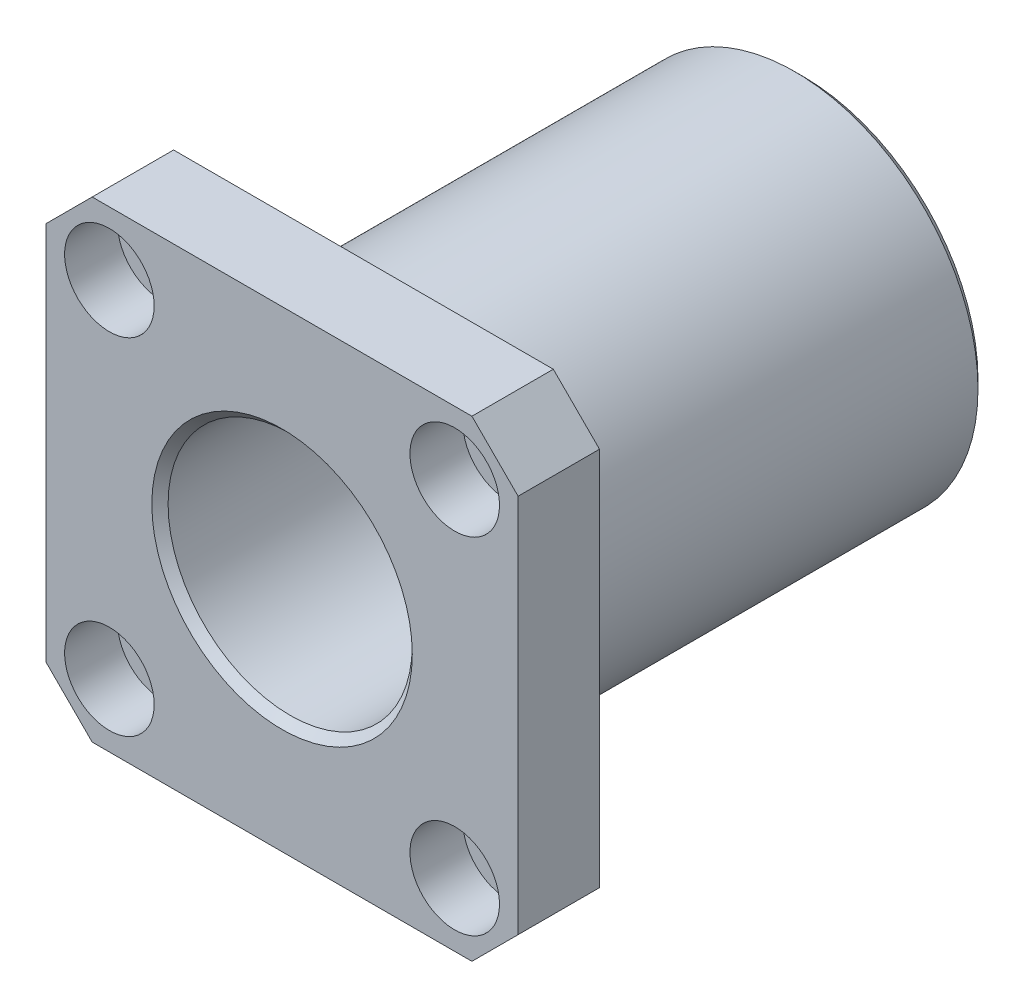
ISO-10303-21;
HEADER;
FILE_DESCRIPTION(('STEP AP214'),'2;1');
FILE_NAME('part.step','',(''),(''),'','','');
FILE_SCHEMA(('AUTOMOTIVE_DESIGN { 1 0 10303 214 1 1 1 1 }'));
ENDSEC;
DATA;
#1=APPLICATION_CONTEXT('core data for automotive mechanical design processes');
#2=APPLICATION_PROTOCOL_DEFINITION('international standard','automotive_design',2000,#1);
#3=PRODUCT_CONTEXT('',#1,'mechanical');
#4=PRODUCT('Part','Part','',(#3));
#5=PRODUCT_RELATED_PRODUCT_CATEGORY('part','',(#4));
#6=PRODUCT_DEFINITION_FORMATION('','',#4);
#7=PRODUCT_DEFINITION_CONTEXT('part definition',#1,'design');
#8=PRODUCT_DEFINITION('design','',#6,#7);
#9=PRODUCT_DEFINITION_SHAPE('','',#8);
#10=(LENGTH_UNIT() NAMED_UNIT(*) SI_UNIT(.MILLI.,.METRE.));
#11=(NAMED_UNIT(*) PLANE_ANGLE_UNIT() SI_UNIT($,.RADIAN.));
#12=(NAMED_UNIT(*) SI_UNIT($,.STERADIAN.) SOLID_ANGLE_UNIT());
#13=UNCERTAINTY_MEASURE_WITH_UNIT(LENGTH_MEASURE(1.E-05),#10,'distance_accuracy_value','');
#14=(GEOMETRIC_REPRESENTATION_CONTEXT(3) GLOBAL_UNCERTAINTY_ASSIGNED_CONTEXT((#13)) GLOBAL_UNIT_ASSIGNED_CONTEXT((#10,
#11,#12)) REPRESENTATION_CONTEXT('',''));
#15=CARTESIAN_POINT('',(0.,0.,0.));
#16=DIRECTION('',(0.,0.,1.));
#17=DIRECTION('',(1.,0.,0.));
#18=AXIS2_PLACEMENT_3D('',#15,#16,#17);
#19=CARTESIAN_POINT('',(0.,0.,64.));
#20=DIRECTION('',(0.,0.,-1.));
#21=DIRECTION('',(-1.,0.,0.));
#22=AXIS2_PLACEMENT_3D('',#19,#20,#21);
#23=CYLINDRICAL_SURFACE('',#22,22.5);
#24=CARTESIAN_POINT('',(0.,0.,1.));
#25=DIRECTION('',(0.,0.,1.));
#26=DIRECTION('',(1.,0.,0.));
#27=AXIS2_PLACEMENT_3D('',#24,#25,#26);
#28=CIRCLE('',#27,22.5);
#29=CARTESIAN_POINT('',(22.5,0.,1.));
#30=VERTEX_POINT('',#29);
#31=EDGE_CURVE('E141',#30,#30,#28,.T.);
#32=ORIENTED_EDGE('',*,*,#31,.T.);
#33=EDGE_LOOP('',(#32));
#34=FACE_BOUND('',#33,.T.);
#35=CARTESIAN_POINT('',(0.,0.,54.));
#36=DIRECTION('',(0.,0.,-1.));
#37=DIRECTION('',(-1.,0.,0.));
#38=AXIS2_PLACEMENT_3D('',#35,#36,#37);
#39=CIRCLE('',#38,22.5);
#40=CARTESIAN_POINT('',(-22.5,0.,54.));
#41=VERTEX_POINT('',#40);
#42=EDGE_CURVE('E138',#41,#41,#39,.T.);
#43=ORIENTED_EDGE('',*,*,#42,.T.);
#44=EDGE_LOOP('',(#43));
#45=FACE_BOUND('',#44,.T.);
#46=ADVANCED_FACE('F33',(#34,#45),#23,.T.);
#47=CARTESIAN_POINT('',(0.,0.,0.));
#48=DIRECTION('',(0.,0.,1.));
#49=DIRECTION('',(1.,0.,0.));
#50=AXIS2_PLACEMENT_3D('',#47,#48,#49);
#51=PLANE('',#50);
#52=CARTESIAN_POINT('',(0.,0.,0.));
#53=DIRECTION('',(0.,0.,1.));
#54=DIRECTION('',(1.,0.,0.));
#55=AXIS2_PLACEMENT_3D('',#52,#53,#54);
#56=CIRCLE('',#55,21.5);
#57=CARTESIAN_POINT('',(21.5,0.,0.));
#58=VERTEX_POINT('',#57);
#59=EDGE_CURVE('E164',#58,#58,#56,.F.);
#60=ORIENTED_EDGE('',*,*,#59,.T.);
#61=EDGE_LOOP('',(#60));
#62=FACE_BOUND('',#61,.T.);
#63=CARTESIAN_POINT('',(0.,0.,0.));
#64=DIRECTION('',(0.,0.,1.));
#65=DIRECTION('',(1.,0.,0.));
#66=AXIS2_PLACEMENT_3D('',#63,#64,#65);
#67=CIRCLE('',#66,15.);
#68=CARTESIAN_POINT('',(15.,0.,0.));
#69=VERTEX_POINT('',#68);
#70=EDGE_CURVE('E442',#69,#69,#67,.T.);
#71=ORIENTED_EDGE('',*,*,#70,.T.);
#72=EDGE_LOOP('',(#71));
#73=FACE_BOUND('',#72,.T.);
#74=ADVANCED_FACE('F181',(#62,#73),#51,.F.);
#75=CARTESIAN_POINT('',(29.,-29.,54.));
#76=DIRECTION('',(1.,0.,0.));
#77=DIRECTION('',(0.,0.,-1.));
#78=AXIS2_PLACEMENT_3D('',#75,#76,#77);
#79=PLANE('',#78);
#80=DIRECTION('',(0.,0.,1.));
#81=VECTOR('',#80,1.);
#82=CARTESIAN_POINT('',(29.,-23.3259018078045,0.));
#83=LINE('',#82,#81);
#84=CARTESIAN_POINT('',(29.,-23.3259018078045,54.));
#85=VERTEX_POINT('',#84);
#86=CARTESIAN_POINT('',(29.,-23.3259018078045,64.));
#87=VERTEX_POINT('',#86);
#88=EDGE_CURVE('E474',#85,#87,#83,.T.);
#89=ORIENTED_EDGE('',*,*,#88,.F.);
#90=DIRECTION('',(0.,1.,0.));
#91=VECTOR('',#90,1.);
#92=CARTESIAN_POINT('',(29.,-29.,54.));
#93=LINE('',#92,#91);
#94=CARTESIAN_POINT('',(29.,23.3259018078045,54.));
#95=VERTEX_POINT('',#94);
#96=EDGE_CURVE('E117',#85,#95,#93,.T.);
#97=ORIENTED_EDGE('',*,*,#96,.T.);
#98=DIRECTION('',(0.,0.,1.));
#99=VECTOR('',#98,1.);
#100=CARTESIAN_POINT('',(29.,23.3259018078045,0.));
#101=LINE('',#100,#99);
#102=CARTESIAN_POINT('',(29.,23.3259018078045,64.));
#103=VERTEX_POINT('',#102);
#104=EDGE_CURVE('E100',#95,#103,#101,.T.);
#105=ORIENTED_EDGE('',*,*,#104,.T.);
#106=DIRECTION('',(0.,1.,0.));
#107=VECTOR('',#106,1.);
#108=CARTESIAN_POINT('',(29.,-29.,64.));
#109=LINE('',#108,#107);
#110=EDGE_CURVE('E115',#87,#103,#109,.T.);
#111=ORIENTED_EDGE('',*,*,#110,.F.);
#112=EDGE_LOOP('',(#89,#97,#105,#111));
#113=FACE_BOUND('',#112,.T.);
#114=ADVANCED_FACE('F114',(#113),#79,.T.);
#115=CARTESIAN_POINT('',(-29.,-29.,54.));
#116=DIRECTION('',(0.,-1.,0.));
#117=DIRECTION('',(0.,0.,-1.));
#118=AXIS2_PLACEMENT_3D('',#115,#116,#117);
#119=PLANE('',#118);
#120=DIRECTION('',(0.,0.,1.));
#121=VECTOR('',#120,1.);
#122=CARTESIAN_POINT('',(-23.3259018078045,-29.,0.));
#123=LINE('',#122,#121);
#124=CARTESIAN_POINT('',(-23.3259018078045,-29.,54.));
#125=VERTEX_POINT('',#124);
#126=CARTESIAN_POINT('',(-23.3259018078045,-29.,64.));
#127=VERTEX_POINT('',#126);
#128=EDGE_CURVE('E48',#125,#127,#123,.T.);
#129=ORIENTED_EDGE('',*,*,#128,.F.);
#130=DIRECTION('',(1.,0.,0.));
#131=VECTOR('',#130,1.);
#132=CARTESIAN_POINT('',(-29.,-29.,54.));
#133=LINE('',#132,#131);
#134=CARTESIAN_POINT('',(23.3259018078045,-29.,54.));
#135=VERTEX_POINT('',#134);
#136=EDGE_CURVE('E131',#125,#135,#133,.T.);
#137=ORIENTED_EDGE('',*,*,#136,.T.);
#138=DIRECTION('',(0.,0.,1.));
#139=VECTOR('',#138,1.);
#140=CARTESIAN_POINT('',(23.3259018078045,-29.,0.));
#141=LINE('',#140,#139);
#142=CARTESIAN_POINT('',(23.3259018078045,-29.,64.));
#143=VERTEX_POINT('',#142);
#144=EDGE_CURVE('E108',#135,#143,#141,.T.);
#145=ORIENTED_EDGE('',*,*,#144,.T.);
#146=DIRECTION('',(1.,0.,0.));
#147=VECTOR('',#146,1.);
#148=CARTESIAN_POINT('',(-29.,-29.,64.));
#149=LINE('',#148,#147);
#150=EDGE_CURVE('E136',#127,#143,#149,.T.);
#151=ORIENTED_EDGE('',*,*,#150,.F.);
#152=EDGE_LOOP('',(#129,#137,#145,#151));
#153=FACE_BOUND('',#152,.T.);
#154=ADVANCED_FACE('F198',(#153),#119,.T.);
#155=CARTESIAN_POINT('',(-29.,-29.,54.));
#156=DIRECTION('',(-1.,0.,0.));
#157=DIRECTION('',(0.,0.,1.));
#158=AXIS2_PLACEMENT_3D('',#155,#156,#157);
#159=PLANE('',#158);
#160=DIRECTION('',(0.,0.,1.));
#161=VECTOR('',#160,1.);
#162=CARTESIAN_POINT('',(-29.,-23.3259018078045,0.));
#163=LINE('',#162,#161);
#164=CARTESIAN_POINT('',(-29.,-23.3259018078045,54.));
#165=VERTEX_POINT('',#164);
#166=CARTESIAN_POINT('',(-29.,-23.3259018078045,64.));
#167=VERTEX_POINT('',#166);
#168=EDGE_CURVE('E479',#165,#167,#163,.T.);
#169=ORIENTED_EDGE('',*,*,#168,.T.);
#170=DIRECTION('',(0.,-1.,0.));
#171=VECTOR('',#170,1.);
#172=CARTESIAN_POINT('',(-29.,-29.,64.));
#173=LINE('',#172,#171);
#174=CARTESIAN_POINT('',(-29.,23.3259018078045,64.));
#175=VERTEX_POINT('',#174);
#176=EDGE_CURVE('E126',#175,#167,#173,.T.);
#177=ORIENTED_EDGE('',*,*,#176,.F.);
#178=DIRECTION('',(0.,0.,1.));
#179=VECTOR('',#178,1.);
#180=CARTESIAN_POINT('',(-29.,23.3259018078045,0.));
#181=LINE('',#180,#179);
#182=CARTESIAN_POINT('',(-29.,23.3259018078045,54.));
#183=VERTEX_POINT('',#182);
#184=EDGE_CURVE('E56',#183,#175,#181,.T.);
#185=ORIENTED_EDGE('',*,*,#184,.F.);
#186=DIRECTION('',(0.,-1.,0.));
#187=VECTOR('',#186,1.);
#188=CARTESIAN_POINT('',(-29.,-29.,54.));
#189=LINE('',#188,#187);
#190=EDGE_CURVE('E496',#183,#165,#189,.T.);
#191=ORIENTED_EDGE('',*,*,#190,.T.);
#192=EDGE_LOOP('',(#169,#177,#185,#191));
#193=FACE_BOUND('',#192,.T.);
#194=ADVANCED_FACE('F202',(#193),#159,.T.);
#195=CARTESIAN_POINT('',(-29.,29.,54.));
#196=DIRECTION('',(0.,1.,0.));
#197=DIRECTION('',(0.,0.,1.));
#198=AXIS2_PLACEMENT_3D('',#195,#196,#197);
#199=PLANE('',#198);
#200=DIRECTION('',(0.,0.,1.));
#201=VECTOR('',#200,1.);
#202=CARTESIAN_POINT('',(23.3259018078045,29.,0.));
#203=LINE('',#202,#201);
#204=CARTESIAN_POINT('',(23.3259018078045,29.,54.));
#205=VERTEX_POINT('',#204);
#206=CARTESIAN_POINT('',(23.3259018078045,29.,64.));
#207=VERTEX_POINT('',#206);
#208=EDGE_CURVE('E103',#205,#207,#203,.T.);
#209=ORIENTED_EDGE('',*,*,#208,.F.);
#210=DIRECTION('',(-1.,0.,0.));
#211=VECTOR('',#210,1.);
#212=CARTESIAN_POINT('',(-29.,29.,54.));
#213=LINE('',#212,#211);
#214=CARTESIAN_POINT('',(-23.3259018078045,29.,54.));
#215=VERTEX_POINT('',#214);
#216=EDGE_CURVE('E494',#205,#215,#213,.T.);
#217=ORIENTED_EDGE('',*,*,#216,.T.);
#218=DIRECTION('',(0.,0.,1.));
#219=VECTOR('',#218,1.);
#220=CARTESIAN_POINT('',(-23.3259018078045,29.,0.));
#221=LINE('',#220,#219);
#222=CARTESIAN_POINT('',(-23.3259018078045,29.,64.));
#223=VERTEX_POINT('',#222);
#224=EDGE_CURVE('E484',#215,#223,#221,.T.);
#225=ORIENTED_EDGE('',*,*,#224,.T.);
#226=DIRECTION('',(-1.,0.,0.));
#227=VECTOR('',#226,1.);
#228=CARTESIAN_POINT('',(-29.,29.,64.));
#229=LINE('',#228,#227);
#230=EDGE_CURVE('E123',#207,#223,#229,.T.);
#231=ORIENTED_EDGE('',*,*,#230,.F.);
#232=EDGE_LOOP('',(#209,#217,#225,#231));
#233=FACE_BOUND('',#232,.T.);
#234=ADVANCED_FACE('F199',(#233),#199,.T.);
#235=CARTESIAN_POINT('',(0.,0.,54.));
#236=DIRECTION('',(0.,0.,-1.));
#237=DIRECTION('',(-1.,0.,0.));
#238=AXIS2_PLACEMENT_3D('',#235,#236,#237);
#239=PLANE('',#238);
#240=CARTESIAN_POINT('',(-21.2132034355964,21.2132034355964,54.));
#241=DIRECTION('',(0.,0.,-1.));
#242=DIRECTION('',(-1.,0.,0.));
#243=AXIS2_PLACEMENT_3D('',#240,#241,#242);
#244=CIRCLE('',#243,3.3);
#245=CARTESIAN_POINT('',(-24.5132034355964,21.2132034355964,54.));
#246=VERTEX_POINT('',#245);
#247=EDGE_CURVE('E157',#246,#246,#244,.T.);
#248=ORIENTED_EDGE('',*,*,#247,.F.);
#249=EDGE_LOOP('',(#248));
#250=FACE_BOUND('',#249,.T.);
#251=CARTESIAN_POINT('',(21.2132034355964,21.2132034355964,54.));
#252=DIRECTION('',(0.,0.,-1.));
#253=DIRECTION('',(-1.,0.,0.));
#254=AXIS2_PLACEMENT_3D('',#251,#252,#253);
#255=CIRCLE('',#254,3.3);
#256=CARTESIAN_POINT('',(17.9132034355964,21.2132034355964,54.));
#257=VERTEX_POINT('',#256);
#258=EDGE_CURVE('E152',#257,#257,#255,.T.);
#259=ORIENTED_EDGE('',*,*,#258,.F.);
#260=EDGE_LOOP('',(#259));
#261=FACE_BOUND('',#260,.T.);
#262=CARTESIAN_POINT('',(21.2132034355964,-21.2132034355964,54.));
#263=DIRECTION('',(0.,0.,-1.));
#264=DIRECTION('',(-1.,0.,0.));
#265=AXIS2_PLACEMENT_3D('',#262,#263,#264);
#266=CIRCLE('',#265,3.3);
#267=CARTESIAN_POINT('',(17.9132034355964,-21.2132034355964,54.));
#268=VERTEX_POINT('',#267);
#269=EDGE_CURVE('E147',#268,#268,#266,.T.);
#270=ORIENTED_EDGE('',*,*,#269,.F.);
#271=EDGE_LOOP('',(#270));
#272=FACE_BOUND('',#271,.T.);
#273=CARTESIAN_POINT('',(-21.2132034355964,-21.2132034355964,54.));
#274=DIRECTION('',(0.,0.,-1.));
#275=DIRECTION('',(-1.,0.,0.));
#276=AXIS2_PLACEMENT_3D('',#273,#274,#275);
#277=CIRCLE('',#276,3.3);
#278=CARTESIAN_POINT('',(-24.5132034355964,-21.2132034355964,54.));
#279=VERTEX_POINT('',#278);
#280=EDGE_CURVE('E142',#279,#279,#277,.T.);
#281=ORIENTED_EDGE('',*,*,#280,.F.);
#282=EDGE_LOOP('',(#281));
#283=FACE_BOUND('',#282,.T.);
#284=DIRECTION('',(0.707106781186548,-0.707106781186547,0.));
#285=VECTOR('',#284,1.);
#286=CARTESIAN_POINT('',(-26.1629509039023,-26.1629509039023,54.));
#287=LINE('',#286,#285);
#288=EDGE_CURVE('E124',#165,#125,#287,.T.);
#289=ORIENTED_EDGE('',*,*,#288,.F.);
#290=ORIENTED_EDGE('',*,*,#190,.F.);
#291=DIRECTION('',(-0.707106781186548,-0.707106781186547,0.));
#292=VECTOR('',#291,1.);
#293=CARTESIAN_POINT('',(-26.1629509039023,26.1629509039023,54.));
#294=LINE('',#293,#292);
#295=EDGE_CURVE('E487',#215,#183,#294,.T.);
#296=ORIENTED_EDGE('',*,*,#295,.F.);
#297=ORIENTED_EDGE('',*,*,#216,.F.);
#298=DIRECTION('',(-0.707106781186548,0.707106781186547,0.));
#299=VECTOR('',#298,1.);
#300=CARTESIAN_POINT('',(26.1629509039023,26.1629509039023,54.));
#301=LINE('',#300,#299);
#302=EDGE_CURVE('E490',#95,#205,#301,.T.);
#303=ORIENTED_EDGE('',*,*,#302,.F.);
#304=ORIENTED_EDGE('',*,*,#96,.F.);
#305=DIRECTION('',(0.707106781186548,0.707106781186547,0.));
#306=VECTOR('',#305,1.);
#307=CARTESIAN_POINT('',(26.1629509039023,-26.1629509039023,54.));
#308=LINE('',#307,#306);
#309=EDGE_CURVE('E128',#135,#85,#308,.T.);
#310=ORIENTED_EDGE('',*,*,#309,.F.);
#311=ORIENTED_EDGE('',*,*,#136,.F.);
#312=EDGE_LOOP('',(#289,#290,#296,#297,#303,#304,#310,#311));
#313=FACE_BOUND('',#312,.T.);
#314=ORIENTED_EDGE('',*,*,#42,.F.);
#315=EDGE_LOOP('',(#314));
#316=FACE_BOUND('',#315,.T.);
#317=ADVANCED_FACE('F194',(#250,#261,#272,#283,#313,#316),#239,.T.);
#318=CARTESIAN_POINT('',(0.,0.,64.));
#319=DIRECTION('',(0.,0.,1.));
#320=DIRECTION('',(1.,0.,0.));
#321=AXIS2_PLACEMENT_3D('',#318,#319,#320);
#322=PLANE('',#321);
#323=CARTESIAN_POINT('',(0.,0.,64.));
#324=DIRECTION('',(0.,0.,1.));
#325=DIRECTION('',(1.,0.,0.));
#326=AXIS2_PLACEMENT_3D('',#323,#324,#325);
#327=CIRCLE('',#326,16.);
#328=CARTESIAN_POINT('',(16.,0.,64.));
#329=VERTEX_POINT('',#328);
#330=EDGE_CURVE('E11',#329,#329,#327,.F.);
#331=ORIENTED_EDGE('',*,*,#330,.T.);
#332=EDGE_LOOP('',(#331));
#333=FACE_BOUND('',#332,.T.);
#334=CARTESIAN_POINT('',(-21.2132034355964,21.2132034355964,64.));
#335=DIRECTION('',(0.,0.,1.));
#336=DIRECTION('',(1.,0.,0.));
#337=AXIS2_PLACEMENT_3D('',#334,#335,#336);
#338=CIRCLE('',#337,5.5);
#339=CARTESIAN_POINT('',(-15.7132034355964,21.2132034355964,64.));
#340=VERTEX_POINT('',#339);
#341=EDGE_CURVE('E440',#340,#340,#338,.T.);
#342=ORIENTED_EDGE('',*,*,#341,.F.);
#343=EDGE_LOOP('',(#342));
#344=FACE_BOUND('',#343,.T.);
#345=CARTESIAN_POINT('',(21.2132034355964,21.2132034355964,64.));
#346=DIRECTION('',(0.,0.,1.));
#347=DIRECTION('',(1.,0.,0.));
#348=AXIS2_PLACEMENT_3D('',#345,#346,#347);
#349=CIRCLE('',#348,5.5);
#350=CARTESIAN_POINT('',(26.7132034355964,21.2132034355964,64.));
#351=VERTEX_POINT('',#350);
#352=EDGE_CURVE('E160',#351,#351,#349,.T.);
#353=ORIENTED_EDGE('',*,*,#352,.F.);
#354=EDGE_LOOP('',(#353));
#355=FACE_BOUND('',#354,.T.);
#356=CARTESIAN_POINT('',(21.2132034355964,-21.2132034355964,64.));
#357=DIRECTION('',(0.,0.,1.));
#358=DIRECTION('',(1.,0.,0.));
#359=AXIS2_PLACEMENT_3D('',#356,#357,#358);
#360=CIRCLE('',#359,5.5);
#361=CARTESIAN_POINT('',(26.7132034355964,-21.2132034355964,64.));
#362=VERTEX_POINT('',#361);
#363=EDGE_CURVE('E155',#362,#362,#360,.T.);
#364=ORIENTED_EDGE('',*,*,#363,.F.);
#365=EDGE_LOOP('',(#364));
#366=FACE_BOUND('',#365,.T.);
#367=CARTESIAN_POINT('',(-21.2132034355964,-21.2132034355964,64.));
#368=DIRECTION('',(0.,0.,1.));
#369=DIRECTION('',(1.,0.,0.));
#370=AXIS2_PLACEMENT_3D('',#367,#368,#369);
#371=CIRCLE('',#370,5.5);
#372=CARTESIAN_POINT('',(-15.7132034355964,-21.2132034355964,64.));
#373=VERTEX_POINT('',#372);
#374=EDGE_CURVE('E150',#373,#373,#371,.T.);
#375=ORIENTED_EDGE('',*,*,#374,.F.);
#376=EDGE_LOOP('',(#375));
#377=FACE_BOUND('',#376,.T.);
#378=DIRECTION('',(-0.707106781186548,0.707106781186547,0.));
#379=VECTOR('',#378,1.);
#380=CARTESIAN_POINT('',(-29.,-23.3259018078045,64.));
#381=LINE('',#380,#379);
#382=EDGE_CURVE('E145',#127,#167,#381,.T.);
#383=ORIENTED_EDGE('',*,*,#382,.F.);
#384=ORIENTED_EDGE('',*,*,#150,.T.);
#385=DIRECTION('',(-0.707106781186548,-0.707106781186547,0.));
#386=VECTOR('',#385,1.);
#387=CARTESIAN_POINT('',(29.,-23.3259018078045,64.));
#388=LINE('',#387,#386);
#389=EDGE_CURVE('E122',#87,#143,#388,.T.);
#390=ORIENTED_EDGE('',*,*,#389,.F.);
#391=ORIENTED_EDGE('',*,*,#110,.T.);
#392=DIRECTION('',(0.707106781186548,-0.707106781186547,0.));
#393=VECTOR('',#392,1.);
#394=CARTESIAN_POINT('',(29.,23.3259018078045,64.));
#395=LINE('',#394,#393);
#396=EDGE_CURVE('E97',#207,#103,#395,.T.);
#397=ORIENTED_EDGE('',*,*,#396,.F.);
#398=ORIENTED_EDGE('',*,*,#230,.T.);
#399=DIRECTION('',(0.707106781186548,0.707106781186547,0.));
#400=VECTOR('',#399,1.);
#401=CARTESIAN_POINT('',(-29.,23.3259018078045,64.));
#402=LINE('',#401,#400);
#403=EDGE_CURVE('E471',#175,#223,#402,.T.);
#404=ORIENTED_EDGE('',*,*,#403,.F.);
#405=ORIENTED_EDGE('',*,*,#176,.T.);
#406=EDGE_LOOP('',(#383,#384,#390,#391,#397,#398,#404,#405));
#407=FACE_BOUND('',#406,.T.);
#408=ADVANCED_FACE('F120',(#333,#344,#355,#366,#377,#407),#322,.T.);
#409=CARTESIAN_POINT('',(-29.,23.3259018078045,0.));
#410=DIRECTION('',(0.707106781186547,-0.707106781186548,0.));
#411=DIRECTION('',(0.707106781186548,0.707106781186547,0.));
#412=AXIS2_PLACEMENT_3D('',#409,#410,#411);
#413=PLANE('',#412);
#414=ORIENTED_EDGE('',*,*,#295,.T.);
#415=ORIENTED_EDGE('',*,*,#184,.T.);
#416=ORIENTED_EDGE('',*,*,#403,.T.);
#417=ORIENTED_EDGE('',*,*,#224,.F.);
#418=EDGE_LOOP('',(#414,#415,#416,#417));
#419=FACE_BOUND('',#418,.T.);
#420=ADVANCED_FACE('F193',(#419),#413,.F.);
#421=CARTESIAN_POINT('',(29.,23.3259018078045,0.));
#422=DIRECTION('',(-0.707106781186547,-0.707106781186548,0.));
#423=DIRECTION('',(0.707106781186548,-0.707106781186547,0.));
#424=AXIS2_PLACEMENT_3D('',#421,#422,#423);
#425=PLANE('',#424);
#426=ORIENTED_EDGE('',*,*,#302,.T.);
#427=ORIENTED_EDGE('',*,*,#208,.T.);
#428=ORIENTED_EDGE('',*,*,#396,.T.);
#429=ORIENTED_EDGE('',*,*,#104,.F.);
#430=EDGE_LOOP('',(#426,#427,#428,#429));
#431=FACE_BOUND('',#430,.T.);
#432=ADVANCED_FACE('F99',(#431),#425,.F.);
#433=CARTESIAN_POINT('',(29.,-23.3259018078045,0.));
#434=DIRECTION('',(-0.707106781186547,0.707106781186548,0.));
#435=DIRECTION('',(-0.707106781186548,-0.707106781186547,0.));
#436=AXIS2_PLACEMENT_3D('',#433,#434,#435);
#437=PLANE('',#436);
#438=ORIENTED_EDGE('',*,*,#309,.T.);
#439=ORIENTED_EDGE('',*,*,#88,.T.);
#440=ORIENTED_EDGE('',*,*,#389,.T.);
#441=ORIENTED_EDGE('',*,*,#144,.F.);
#442=EDGE_LOOP('',(#438,#439,#440,#441));
#443=FACE_BOUND('',#442,.T.);
#444=ADVANCED_FACE('F219',(#443),#437,.F.);
#445=CARTESIAN_POINT('',(-29.,-23.3259018078045,0.));
#446=DIRECTION('',(0.707106781186547,0.707106781186548,0.));
#447=DIRECTION('',(-0.707106781186548,0.707106781186547,0.));
#448=AXIS2_PLACEMENT_3D('',#445,#446,#447);
#449=PLANE('',#448);
#450=ORIENTED_EDGE('',*,*,#288,.T.);
#451=ORIENTED_EDGE('',*,*,#128,.T.);
#452=ORIENTED_EDGE('',*,*,#382,.T.);
#453=ORIENTED_EDGE('',*,*,#168,.F.);
#454=EDGE_LOOP('',(#450,#451,#452,#453));
#455=FACE_BOUND('',#454,.T.);
#456=ADVANCED_FACE('F215',(#455),#449,.F.);
#457=CARTESIAN_POINT('',(-21.2132034355964,-21.2132034355964,64.));
#458=DIRECTION('',(0.,0.,1.));
#459=DIRECTION('',(1.,0.,0.));
#460=AXIS2_PLACEMENT_3D('',#457,#458,#459);
#461=CYLINDRICAL_SURFACE('',#460,3.3);
#462=ORIENTED_EDGE('',*,*,#280,.T.);
#463=EDGE_LOOP('',(#462));
#464=FACE_BOUND('',#463,.T.);
#465=CARTESIAN_POINT('',(-21.2132034355964,-21.2132034355964,57.5));
#466=DIRECTION('',(0.,0.,1.));
#467=DIRECTION('',(1.,0.,0.));
#468=AXIS2_PLACEMENT_3D('',#465,#466,#467);
#469=CIRCLE('',#468,3.3);
#470=CARTESIAN_POINT('',(-17.9132034355964,-21.2132034355964,57.5));
#471=VERTEX_POINT('',#470);
#472=EDGE_CURVE('E146',#471,#471,#469,.T.);
#473=ORIENTED_EDGE('',*,*,#472,.T.);
#474=EDGE_LOOP('',(#473));
#475=FACE_BOUND('',#474,.T.);
#476=ADVANCED_FACE('F218',(#464,#475),#461,.F.);
#477=CARTESIAN_POINT('',(-17.9132034355964,-21.2132034355964,57.5));
#478=DIRECTION('',(0.,0.,-1.));
#479=DIRECTION('',(-1.,0.,0.));
#480=AXIS2_PLACEMENT_3D('',#477,#478,#479);
#481=PLANE('',#480);
#482=ORIENTED_EDGE('',*,*,#472,.F.);
#483=EDGE_LOOP('',(#482));
#484=FACE_BOUND('',#483,.T.);
#485=CARTESIAN_POINT('',(-21.2132034355964,-21.2132034355964,57.5));
#486=DIRECTION('',(0.,0.,1.));
#487=DIRECTION('',(1.,0.,0.));
#488=AXIS2_PLACEMENT_3D('',#485,#486,#487);
#489=CIRCLE('',#488,5.5);
#490=CARTESIAN_POINT('',(-15.7132034355964,-21.2132034355964,57.5));
#491=VERTEX_POINT('',#490);
#492=EDGE_CURVE('E466',#491,#491,#489,.T.);
#493=ORIENTED_EDGE('',*,*,#492,.T.);
#494=EDGE_LOOP('',(#493));
#495=FACE_BOUND('',#494,.T.);
#496=ADVANCED_FACE('F227',(#484,#495),#481,.F.);
#497=CARTESIAN_POINT('',(-21.2132034355964,-21.2132034355964,64.));
#498=DIRECTION('',(0.,0.,1.));
#499=DIRECTION('',(1.,0.,0.));
#500=AXIS2_PLACEMENT_3D('',#497,#498,#499);
#501=CYLINDRICAL_SURFACE('',#500,5.5);
#502=ORIENTED_EDGE('',*,*,#492,.F.);
#503=EDGE_LOOP('',(#502));
#504=FACE_BOUND('',#503,.T.);
#505=ORIENTED_EDGE('',*,*,#374,.T.);
#506=EDGE_LOOP('',(#505));
#507=FACE_BOUND('',#506,.T.);
#508=ADVANCED_FACE('F231',(#504,#507),#501,.F.);
#509=CARTESIAN_POINT('',(21.2132034355964,-21.2132034355964,64.));
#510=DIRECTION('',(0.,0.,1.));
#511=DIRECTION('',(1.,0.,0.));
#512=AXIS2_PLACEMENT_3D('',#509,#510,#511);
#513=CYLINDRICAL_SURFACE('',#512,3.3);
#514=ORIENTED_EDGE('',*,*,#269,.T.);
#515=EDGE_LOOP('',(#514));
#516=FACE_BOUND('',#515,.T.);
#517=CARTESIAN_POINT('',(21.2132034355964,-21.2132034355964,57.5));
#518=DIRECTION('',(0.,0.,1.));
#519=DIRECTION('',(1.,0.,0.));
#520=AXIS2_PLACEMENT_3D('',#517,#518,#519);
#521=CIRCLE('',#520,3.3);
#522=CARTESIAN_POINT('',(24.5132034355964,-21.2132034355964,57.5));
#523=VERTEX_POINT('',#522);
#524=EDGE_CURVE('E151',#523,#523,#521,.T.);
#525=ORIENTED_EDGE('',*,*,#524,.T.);
#526=EDGE_LOOP('',(#525));
#527=FACE_BOUND('',#526,.T.);
#528=ADVANCED_FACE('F235',(#516,#527),#513,.F.);
#529=CARTESIAN_POINT('',(24.5132034355964,-21.2132034355964,57.5));
#530=DIRECTION('',(0.,0.,-1.));
#531=DIRECTION('',(-1.,0.,0.));
#532=AXIS2_PLACEMENT_3D('',#529,#530,#531);
#533=PLANE('',#532);
#534=ORIENTED_EDGE('',*,*,#524,.F.);
#535=EDGE_LOOP('',(#534));
#536=FACE_BOUND('',#535,.T.);
#537=CARTESIAN_POINT('',(21.2132034355964,-21.2132034355964,57.5));
#538=DIRECTION('',(0.,0.,1.));
#539=DIRECTION('',(1.,0.,0.));
#540=AXIS2_PLACEMENT_3D('',#537,#538,#539);
#541=CIRCLE('',#540,5.5);
#542=CARTESIAN_POINT('',(26.7132034355964,-21.2132034355964,57.5));
#543=VERTEX_POINT('',#542);
#544=EDGE_CURVE('E459',#543,#543,#541,.T.);
#545=ORIENTED_EDGE('',*,*,#544,.T.);
#546=EDGE_LOOP('',(#545));
#547=FACE_BOUND('',#546,.T.);
#548=ADVANCED_FACE('F239',(#536,#547),#533,.F.);
#549=CARTESIAN_POINT('',(21.2132034355964,-21.2132034355964,64.));
#550=DIRECTION('',(0.,0.,1.));
#551=DIRECTION('',(1.,0.,0.));
#552=AXIS2_PLACEMENT_3D('',#549,#550,#551);
#553=CYLINDRICAL_SURFACE('',#552,5.5);
#554=ORIENTED_EDGE('',*,*,#544,.F.);
#555=EDGE_LOOP('',(#554));
#556=FACE_BOUND('',#555,.T.);
#557=ORIENTED_EDGE('',*,*,#363,.T.);
#558=EDGE_LOOP('',(#557));
#559=FACE_BOUND('',#558,.T.);
#560=ADVANCED_FACE('F243',(#556,#559),#553,.F.);
#561=CARTESIAN_POINT('',(21.2132034355964,21.2132034355964,64.));
#562=DIRECTION('',(0.,0.,1.));
#563=DIRECTION('',(1.,0.,0.));
#564=AXIS2_PLACEMENT_3D('',#561,#562,#563);
#565=CYLINDRICAL_SURFACE('',#564,3.3);
#566=ORIENTED_EDGE('',*,*,#258,.T.);
#567=EDGE_LOOP('',(#566));
#568=FACE_BOUND('',#567,.T.);
#569=CARTESIAN_POINT('',(21.2132034355964,21.2132034355964,57.5));
#570=DIRECTION('',(0.,0.,1.));
#571=DIRECTION('',(1.,0.,0.));
#572=AXIS2_PLACEMENT_3D('',#569,#570,#571);
#573=CIRCLE('',#572,3.3);
#574=CARTESIAN_POINT('',(24.5132034355964,21.2132034355964,57.5));
#575=VERTEX_POINT('',#574);
#576=EDGE_CURVE('E156',#575,#575,#573,.T.);
#577=ORIENTED_EDGE('',*,*,#576,.T.);
#578=EDGE_LOOP('',(#577));
#579=FACE_BOUND('',#578,.T.);
#580=ADVANCED_FACE('F247',(#568,#579),#565,.F.);
#581=CARTESIAN_POINT('',(24.5132034355964,21.2132034355964,57.5));
#582=DIRECTION('',(0.,0.,-1.));
#583=DIRECTION('',(-1.,0.,0.));
#584=AXIS2_PLACEMENT_3D('',#581,#582,#583);
#585=PLANE('',#584);
#586=ORIENTED_EDGE('',*,*,#576,.F.);
#587=EDGE_LOOP('',(#586));
#588=FACE_BOUND('',#587,.T.);
#589=CARTESIAN_POINT('',(21.2132034355964,21.2132034355964,57.5));
#590=DIRECTION('',(0.,0.,1.));
#591=DIRECTION('',(1.,0.,0.));
#592=AXIS2_PLACEMENT_3D('',#589,#590,#591);
#593=CIRCLE('',#592,5.5);
#594=CARTESIAN_POINT('',(26.7132034355964,21.2132034355964,57.5));
#595=VERTEX_POINT('',#594);
#596=EDGE_CURVE('E452',#595,#595,#593,.T.);
#597=ORIENTED_EDGE('',*,*,#596,.T.);
#598=EDGE_LOOP('',(#597));
#599=FACE_BOUND('',#598,.T.);
#600=ADVANCED_FACE('F251',(#588,#599),#585,.F.);
#601=CARTESIAN_POINT('',(21.2132034355964,21.2132034355964,64.));
#602=DIRECTION('',(0.,0.,1.));
#603=DIRECTION('',(1.,0.,0.));
#604=AXIS2_PLACEMENT_3D('',#601,#602,#603);
#605=CYLINDRICAL_SURFACE('',#604,5.5);
#606=ORIENTED_EDGE('',*,*,#596,.F.);
#607=EDGE_LOOP('',(#606));
#608=FACE_BOUND('',#607,.T.);
#609=ORIENTED_EDGE('',*,*,#352,.T.);
#610=EDGE_LOOP('',(#609));
#611=FACE_BOUND('',#610,.T.);
#612=ADVANCED_FACE('F255',(#608,#611),#605,.F.);
#613=CARTESIAN_POINT('',(-21.2132034355964,21.2132034355964,64.));
#614=DIRECTION('',(0.,0.,1.));
#615=DIRECTION('',(1.,0.,0.));
#616=AXIS2_PLACEMENT_3D('',#613,#614,#615);
#617=CYLINDRICAL_SURFACE('',#616,3.3);
#618=ORIENTED_EDGE('',*,*,#247,.T.);
#619=EDGE_LOOP('',(#618));
#620=FACE_BOUND('',#619,.T.);
#621=CARTESIAN_POINT('',(-21.2132034355964,21.2132034355964,57.5));
#622=DIRECTION('',(0.,0.,1.));
#623=DIRECTION('',(1.,0.,0.));
#624=AXIS2_PLACEMENT_3D('',#621,#622,#623);
#625=CIRCLE('',#624,3.3);
#626=CARTESIAN_POINT('',(-17.9132034355964,21.2132034355964,57.5));
#627=VERTEX_POINT('',#626);
#628=EDGE_CURVE('E161',#627,#627,#625,.T.);
#629=ORIENTED_EDGE('',*,*,#628,.T.);
#630=EDGE_LOOP('',(#629));
#631=FACE_BOUND('',#630,.T.);
#632=ADVANCED_FACE('F259',(#620,#631),#617,.F.);
#633=CARTESIAN_POINT('',(-17.9132034355964,21.2132034355964,57.5));
#634=DIRECTION('',(0.,0.,-1.));
#635=DIRECTION('',(-1.,0.,0.));
#636=AXIS2_PLACEMENT_3D('',#633,#634,#635);
#637=PLANE('',#636);
#638=ORIENTED_EDGE('',*,*,#628,.F.);
#639=EDGE_LOOP('',(#638));
#640=FACE_BOUND('',#639,.T.);
#641=CARTESIAN_POINT('',(-21.2132034355964,21.2132034355964,57.5));
#642=DIRECTION('',(0.,0.,1.));
#643=DIRECTION('',(1.,0.,0.));
#644=AXIS2_PLACEMENT_3D('',#641,#642,#643);
#645=CIRCLE('',#644,5.5);
#646=CARTESIAN_POINT('',(-15.7132034355964,21.2132034355964,57.5));
#647=VERTEX_POINT('',#646);
#648=EDGE_CURVE('E437',#647,#647,#645,.T.);
#649=ORIENTED_EDGE('',*,*,#648,.T.);
#650=EDGE_LOOP('',(#649));
#651=FACE_BOUND('',#650,.T.);
#652=ADVANCED_FACE('F263',(#640,#651),#637,.F.);
#653=CARTESIAN_POINT('',(-21.2132034355964,21.2132034355964,64.));
#654=DIRECTION('',(0.,0.,1.));
#655=DIRECTION('',(1.,0.,0.));
#656=AXIS2_PLACEMENT_3D('',#653,#654,#655);
#657=CYLINDRICAL_SURFACE('',#656,5.5);
#658=ORIENTED_EDGE('',*,*,#648,.F.);
#659=EDGE_LOOP('',(#658));
#660=FACE_BOUND('',#659,.T.);
#661=ORIENTED_EDGE('',*,*,#341,.T.);
#662=EDGE_LOOP('',(#661));
#663=FACE_BOUND('',#662,.T.);
#664=ADVANCED_FACE('F267',(#660,#663),#657,.F.);
#665=CARTESIAN_POINT('',(0.,0.,0.));
#666=DIRECTION('',(0.,0.,1.));
#667=DIRECTION('',(1.,0.,0.));
#668=AXIS2_PLACEMENT_3D('',#665,#666,#667);
#669=CYLINDRICAL_SURFACE('',#668,15.);
#670=CARTESIAN_POINT('',(0.,0.,63.));
#671=DIRECTION('',(0.,0.,1.));
#672=DIRECTION('',(1.,0.,0.));
#673=AXIS2_PLACEMENT_3D('',#670,#671,#672);
#674=CIRCLE('',#673,15.);
#675=CARTESIAN_POINT('',(15.,0.,63.));
#676=VERTEX_POINT('',#675);
#677=EDGE_CURVE('E41',#676,#676,#674,.T.);
#678=ORIENTED_EDGE('',*,*,#677,.T.);
#679=EDGE_LOOP('',(#678));
#680=FACE_BOUND('',#679,.T.);
#681=ORIENTED_EDGE('',*,*,#70,.F.);
#682=EDGE_LOOP('',(#681));
#683=FACE_BOUND('',#682,.T.);
#684=ADVANCED_FACE('F169',(#680,#683),#669,.F.);
#685=CARTESIAN_POINT('',(0.,0.,1.));
#686=DIRECTION('',(0.,0.,1.));
#687=DIRECTION('',(1.,0.,0.));
#688=AXIS2_PLACEMENT_3D('',#685,#686,#687);
#689=CONICAL_SURFACE('',#688,22.5,0.785398163397448);
#690=ORIENTED_EDGE('',*,*,#59,.F.);
#691=EDGE_LOOP('',(#690));
#692=FACE_BOUND('',#691,.T.);
#693=ORIENTED_EDGE('',*,*,#31,.F.);
#694=EDGE_LOOP('',(#693));
#695=FACE_BOUND('',#694,.T.);
#696=ADVANCED_FACE('F173',(#692,#695),#689,.T.);
#697=CARTESIAN_POINT('',(0.,0.,63.));
#698=DIRECTION('',(0.,0.,1.));
#699=DIRECTION('',(1.,0.,0.));
#700=AXIS2_PLACEMENT_3D('',#697,#698,#699);
#701=CONICAL_SURFACE('',#700,15.,0.785398163397448);
#702=ORIENTED_EDGE('',*,*,#330,.F.);
#703=EDGE_LOOP('',(#702));
#704=FACE_BOUND('',#703,.T.);
#705=ORIENTED_EDGE('',*,*,#677,.F.);
#706=EDGE_LOOP('',(#705));
#707=FACE_BOUND('',#706,.T.);
#708=ADVANCED_FACE('F35',(#704,#707),#701,.F.);
#709=CLOSED_SHELL('',(#46,#74,#114,#154,#194,#234,#317,#408,#420,#432,#444,#456,#476,#496,#508,
#528,#548,#560,#580,#600,#612,#632,#652,#664,#684,#696,#708));
#710=MANIFOLD_SOLID_BREP('B2',#709);
#711=ADVANCED_BREP_SHAPE_REPRESENTATION('',(#18,#710),#14);
#712=SHAPE_DEFINITION_REPRESENTATION(#9,#711);
ENDSEC;
END-ISO-10303-21;
